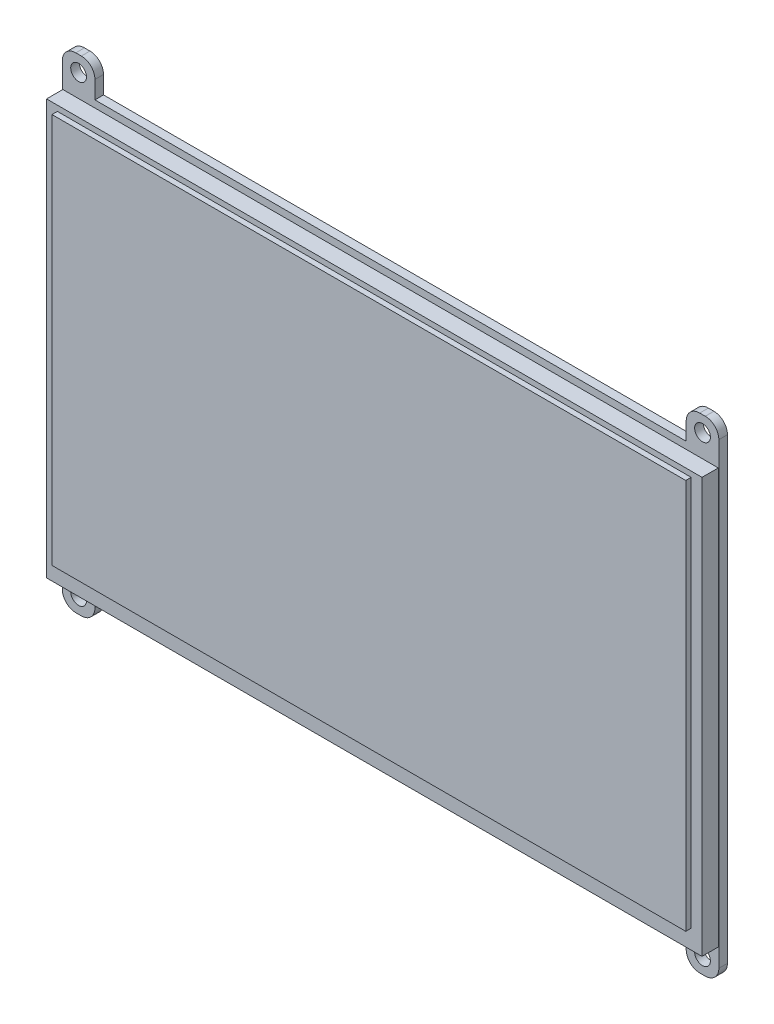
ISO-10303-21;
HEADER;
FILE_DESCRIPTION(('STEP AP214'),'2;1');
FILE_NAME('part.step','',(''),(''),'','','');
FILE_SCHEMA(('AUTOMOTIVE_DESIGN { 1 0 10303 214 1 1 1 1 }'));
ENDSEC;
DATA;
#1=APPLICATION_CONTEXT('core data for automotive mechanical design processes');
#2=APPLICATION_PROTOCOL_DEFINITION('international standard','automotive_design',2000,#1);
#3=PRODUCT_CONTEXT('',#1,'mechanical');
#4=PRODUCT('Part','Part','',(#3));
#5=PRODUCT_RELATED_PRODUCT_CATEGORY('part','',(#4));
#6=PRODUCT_DEFINITION_FORMATION('','',#4);
#7=PRODUCT_DEFINITION_CONTEXT('part definition',#1,'design');
#8=PRODUCT_DEFINITION('design','',#6,#7);
#9=PRODUCT_DEFINITION_SHAPE('','',#8);
#10=(LENGTH_UNIT() NAMED_UNIT(*) SI_UNIT(.MILLI.,.METRE.));
#11=(NAMED_UNIT(*) PLANE_ANGLE_UNIT() SI_UNIT($,.RADIAN.));
#12=(NAMED_UNIT(*) SI_UNIT($,.STERADIAN.) SOLID_ANGLE_UNIT());
#13=UNCERTAINTY_MEASURE_WITH_UNIT(LENGTH_MEASURE(1.E-05),#10,'distance_accuracy_value','');
#14=(GEOMETRIC_REPRESENTATION_CONTEXT(3) GLOBAL_UNCERTAINTY_ASSIGNED_CONTEXT((#13)) GLOBAL_UNIT_ASSIGNED_CONTEXT((#10,
#11,#12)) REPRESENTATION_CONTEXT('',''));
#15=CARTESIAN_POINT('',(0.,0.,0.));
#16=DIRECTION('',(0.,0.,1.));
#17=DIRECTION('',(1.,0.,0.));
#18=AXIS2_PLACEMENT_3D('',#15,#16,#17);
#19=CARTESIAN_POINT('',(0.,0.,4.5875));
#20=DIRECTION('',(0.,0.,1.));
#21=DIRECTION('',(1.,0.,0.));
#22=AXIS2_PLACEMENT_3D('',#19,#20,#21);
#23=PLANE('',#22);
#24=DIRECTION('',(0.,-1.,0.));
#25=VECTOR('',#24,1.);
#26=CARTESIAN_POINT('',(-60.455,37.6641957875411,4.5875));
#27=LINE('',#26,#25);
#28=CARTESIAN_POINT('',(-60.455,37.6641957875411,4.5875));
#29=VERTEX_POINT('',#28);
#30=CARTESIAN_POINT('',(-60.455,-38.865,4.5875));
#31=VERTEX_POINT('',#30);
#32=EDGE_CURVE('E254',#29,#31,#27,.T.);
#33=ORIENTED_EDGE('',*,*,#32,.T.);
#34=DIRECTION('',(1.,0.,0.));
#35=VECTOR('',#34,1.);
#36=CARTESIAN_POINT('',(-60.455,-38.865,4.5875));
#37=LINE('',#36,#35);
#38=CARTESIAN_POINT('',(60.455,-38.865,4.5875));
#39=VERTEX_POINT('',#38);
#40=EDGE_CURVE('E257',#31,#39,#37,.T.);
#41=ORIENTED_EDGE('',*,*,#40,.T.);
#42=DIRECTION('',(0.,1.,0.));
#43=VECTOR('',#42,1.);
#44=CARTESIAN_POINT('',(60.4549999999999,37.6641957875411,4.5875));
#45=LINE('',#44,#43);
#46=CARTESIAN_POINT('',(60.4549999999999,37.6641957875411,4.5875));
#47=VERTEX_POINT('',#46);
#48=EDGE_CURVE('E260',#39,#47,#45,.T.);
#49=ORIENTED_EDGE('',*,*,#48,.T.);
#50=DIRECTION('',(-1.,0.,0.));
#51=VECTOR('',#50,1.);
#52=CARTESIAN_POINT('',(-60.455,37.6641957875411,4.5875));
#53=LINE('',#52,#51);
#54=EDGE_CURVE('E262',#47,#29,#53,.T.);
#55=ORIENTED_EDGE('',*,*,#54,.T.);
#56=EDGE_LOOP('',(#33,#41,#49,#55));
#57=FACE_BOUND('',#56,.T.);
#58=DIRECTION('',(1.,0.,0.));
#59=VECTOR('',#58,1.);
#60=CARTESIAN_POINT('',(-58.455,-35.365,4.5875));
#61=LINE('',#60,#59);
#62=CARTESIAN_POINT('',(-58.455,-35.365,4.5875));
#63=VERTEX_POINT('',#62);
#64=CARTESIAN_POINT('',(58.455,-35.365,4.5875));
#65=VERTEX_POINT('',#64);
#66=EDGE_CURVE('E732',#63,#65,#61,.T.);
#67=ORIENTED_EDGE('',*,*,#66,.F.);
#68=DIRECTION('',(0.,-1.,0.));
#69=VECTOR('',#68,1.);
#70=CARTESIAN_POINT('',(-58.455,36.6641957875411,4.5875));
#71=LINE('',#70,#69);
#72=CARTESIAN_POINT('',(-58.455,36.6641957875411,4.5875));
#73=VERTEX_POINT('',#72);
#74=EDGE_CURVE('E244',#73,#63,#71,.T.);
#75=ORIENTED_EDGE('',*,*,#74,.F.);
#76=DIRECTION('',(-1.,0.,0.));
#77=VECTOR('',#76,1.);
#78=CARTESIAN_POINT('',(-58.455,36.6641957875411,4.5875));
#79=LINE('',#78,#77);
#80=CARTESIAN_POINT('',(58.455,36.6641957875411,4.5875));
#81=VERTEX_POINT('',#80);
#82=EDGE_CURVE('E240',#81,#73,#79,.T.);
#83=ORIENTED_EDGE('',*,*,#82,.F.);
#84=DIRECTION('',(0.,1.,0.));
#85=VECTOR('',#84,1.);
#86=CARTESIAN_POINT('',(58.455,36.6641957875411,4.5875));
#87=LINE('',#86,#85);
#88=EDGE_CURVE('E729',#65,#81,#87,.T.);
#89=ORIENTED_EDGE('',*,*,#88,.F.);
#90=EDGE_LOOP('',(#67,#75,#83,#89));
#91=FACE_BOUND('',#90,.T.);
#92=ADVANCED_FACE('F36',(#57,#91),#23,.T.);
#93=CARTESIAN_POINT('',(0.,0.,1.5875));
#94=DIRECTION('',(0.,0.,1.));
#95=DIRECTION('',(1.,0.,0.));
#96=AXIS2_PLACEMENT_3D('',#93,#94,#95);
#97=PLANE('',#96);
#98=DIRECTION('',(0.,-1.,0.));
#99=VECTOR('',#98,1.);
#100=CARTESIAN_POINT('',(60.555,0.,1.5875));
#101=LINE('',#100,#99);
#102=CARTESIAN_POINT('',(60.5549999999999,42.225,1.5875));
#103=VERTEX_POINT('',#102);
#104=CARTESIAN_POINT('',(60.5549999999999,-42.225,1.5875));
#105=VERTEX_POINT('',#104);
#106=EDGE_CURVE('E278',#103,#105,#101,.T.);
#107=ORIENTED_EDGE('',*,*,#106,.F.);
#108=CARTESIAN_POINT('',(58.0549999999999,42.225,1.5875));
#109=DIRECTION('',(0.,0.,1.));
#110=DIRECTION('',(1.,0.,0.));
#111=AXIS2_PLACEMENT_3D('',#108,#109,#110);
#112=CIRCLE('',#111,2.5);
#113=CARTESIAN_POINT('',(58.0549999999999,44.725,1.5875));
#114=VERTEX_POINT('',#113);
#115=EDGE_CURVE('E281',#114,#103,#112,.F.);
#116=ORIENTED_EDGE('',*,*,#115,.F.);
#117=DIRECTION('',(-1.,0.,0.));
#118=VECTOR('',#117,1.);
#119=CARTESIAN_POINT('',(0.,44.725,1.5875));
#120=LINE('',#119,#118);
#121=CARTESIAN_POINT('',(57.0349999999999,44.725,1.5875));
#122=VERTEX_POINT('',#121);
#123=EDGE_CURVE('E285',#114,#122,#120,.T.);
#124=ORIENTED_EDGE('',*,*,#123,.T.);
#125=CARTESIAN_POINT('',(57.0349999999999,42.225,1.5875));
#126=DIRECTION('',(0.,0.,1.));
#127=DIRECTION('',(1.,0.,0.));
#128=AXIS2_PLACEMENT_3D('',#125,#126,#127);
#129=CIRCLE('',#128,2.5);
#130=CARTESIAN_POINT('',(54.5349999999999,42.225,1.5875));
#131=VERTEX_POINT('',#130);
#132=EDGE_CURVE('E287',#122,#131,#129,.T.);
#133=ORIENTED_EDGE('',*,*,#132,.T.);
#134=DIRECTION('',(0.,1.,0.));
#135=VECTOR('',#134,1.);
#136=CARTESIAN_POINT('',(54.5349999999999,0.,1.5875));
#137=LINE('',#136,#135);
#138=CARTESIAN_POINT('',(54.5349999999999,38.965,1.5875));
#139=VERTEX_POINT('',#138);
#140=EDGE_CURVE('E289',#139,#131,#137,.T.);
#141=ORIENTED_EDGE('',*,*,#140,.F.);
#142=DIRECTION('',(1.,0.,0.));
#143=VECTOR('',#142,1.);
#144=CARTESIAN_POINT('',(0.,38.965,1.5875));
#145=LINE('',#144,#143);
#146=CARTESIAN_POINT('',(-54.535,38.965,1.5875));
#147=VERTEX_POINT('',#146);
#148=EDGE_CURVE('E292',#147,#139,#145,.T.);
#149=ORIENTED_EDGE('',*,*,#148,.F.);
#150=DIRECTION('',(0.,1.,0.));
#151=VECTOR('',#150,1.);
#152=CARTESIAN_POINT('',(-54.535,0.,1.5875));
#153=LINE('',#152,#151);
#154=CARTESIAN_POINT('',(-54.535,42.225,1.5875));
#155=VERTEX_POINT('',#154);
#156=EDGE_CURVE('E295',#147,#155,#153,.T.);
#157=ORIENTED_EDGE('',*,*,#156,.T.);
#158=CARTESIAN_POINT('',(-57.035,42.225,1.5875));
#159=DIRECTION('',(0.,0.,1.));
#160=DIRECTION('',(1.,0.,0.));
#161=AXIS2_PLACEMENT_3D('',#158,#159,#160);
#162=CIRCLE('',#161,2.5);
#163=CARTESIAN_POINT('',(-57.035,44.725,1.5875));
#164=VERTEX_POINT('',#163);
#165=EDGE_CURVE('E297',#164,#155,#162,.F.);
#166=ORIENTED_EDGE('',*,*,#165,.F.);
#167=DIRECTION('',(1.,0.,0.));
#168=VECTOR('',#167,1.);
#169=CARTESIAN_POINT('',(0.,44.725,1.5875));
#170=LINE('',#169,#168);
#171=CARTESIAN_POINT('',(-58.055,44.725,1.5875));
#172=VERTEX_POINT('',#171);
#173=EDGE_CURVE('E300',#172,#164,#170,.T.);
#174=ORIENTED_EDGE('',*,*,#173,.F.);
#175=CARTESIAN_POINT('',(-58.055,42.225,1.5875));
#176=DIRECTION('',(0.,0.,1.));
#177=DIRECTION('',(1.,0.,0.));
#178=AXIS2_PLACEMENT_3D('',#175,#176,#177);
#179=CIRCLE('',#178,2.5);
#180=CARTESIAN_POINT('',(-60.555,42.225,1.5875));
#181=VERTEX_POINT('',#180);
#182=EDGE_CURVE('E303',#172,#181,#179,.T.);
#183=ORIENTED_EDGE('',*,*,#182,.T.);
#184=DIRECTION('',(0.,-1.,0.));
#185=VECTOR('',#184,1.);
#186=CARTESIAN_POINT('',(-60.555,0.,1.5875));
#187=LINE('',#186,#185);
#188=CARTESIAN_POINT('',(-60.555,-42.225,1.5875));
#189=VERTEX_POINT('',#188);
#190=EDGE_CURVE('E305',#181,#189,#187,.T.);
#191=ORIENTED_EDGE('',*,*,#190,.T.);
#192=CARTESIAN_POINT('',(-58.055,-42.225,1.5875));
#193=DIRECTION('',(0.,0.,1.));
#194=DIRECTION('',(1.,0.,0.));
#195=AXIS2_PLACEMENT_3D('',#192,#193,#194);
#196=CIRCLE('',#195,2.5);
#197=CARTESIAN_POINT('',(-58.055,-44.725,1.5875));
#198=VERTEX_POINT('',#197);
#199=EDGE_CURVE('E307',#198,#189,#196,.F.);
#200=ORIENTED_EDGE('',*,*,#199,.F.);
#201=DIRECTION('',(1.,0.,0.));
#202=VECTOR('',#201,1.);
#203=CARTESIAN_POINT('',(0.,-44.725,1.5875));
#204=LINE('',#203,#202);
#205=CARTESIAN_POINT('',(-57.035,-44.725,1.5875));
#206=VERTEX_POINT('',#205);
#207=EDGE_CURVE('E310',#198,#206,#204,.T.);
#208=ORIENTED_EDGE('',*,*,#207,.T.);
#209=CARTESIAN_POINT('',(-57.035,-42.225,1.5875));
#210=DIRECTION('',(0.,0.,1.));
#211=DIRECTION('',(1.,0.,0.));
#212=AXIS2_PLACEMENT_3D('',#209,#210,#211);
#213=CIRCLE('',#212,2.5);
#214=CARTESIAN_POINT('',(-54.535,-42.225,1.5875));
#215=VERTEX_POINT('',#214);
#216=EDGE_CURVE('E312',#206,#215,#213,.T.);
#217=ORIENTED_EDGE('',*,*,#216,.T.);
#218=DIRECTION('',(0.,-1.,0.));
#219=VECTOR('',#218,1.);
#220=CARTESIAN_POINT('',(-54.535,0.,1.5875));
#221=LINE('',#220,#219);
#222=CARTESIAN_POINT('',(-54.535,-38.965,1.5875));
#223=VERTEX_POINT('',#222);
#224=EDGE_CURVE('E314',#223,#215,#221,.T.);
#225=ORIENTED_EDGE('',*,*,#224,.F.);
#226=DIRECTION('',(1.,0.,0.));
#227=VECTOR('',#226,1.);
#228=CARTESIAN_POINT('',(0.,-38.965,1.5875));
#229=LINE('',#228,#227);
#230=CARTESIAN_POINT('',(54.5349999999999,-38.965,1.5875));
#231=VERTEX_POINT('',#230);
#232=EDGE_CURVE('E317',#223,#231,#229,.T.);
#233=ORIENTED_EDGE('',*,*,#232,.T.);
#234=DIRECTION('',(0.,-1.,0.));
#235=VECTOR('',#234,1.);
#236=CARTESIAN_POINT('',(54.5349999999999,0.,1.5875));
#237=LINE('',#236,#235);
#238=CARTESIAN_POINT('',(54.5349999999999,-42.225,1.5875));
#239=VERTEX_POINT('',#238);
#240=EDGE_CURVE('E319',#231,#239,#237,.T.);
#241=ORIENTED_EDGE('',*,*,#240,.T.);
#242=CARTESIAN_POINT('',(57.0349999999999,-42.225,1.5875));
#243=DIRECTION('',(0.,0.,1.));
#244=DIRECTION('',(1.,0.,0.));
#245=AXIS2_PLACEMENT_3D('',#242,#243,#244);
#246=CIRCLE('',#245,2.5);
#247=CARTESIAN_POINT('',(57.0349999999999,-44.725,1.5875));
#248=VERTEX_POINT('',#247);
#249=EDGE_CURVE('E321',#248,#239,#246,.F.);
#250=ORIENTED_EDGE('',*,*,#249,.F.);
#251=DIRECTION('',(-1.,0.,0.));
#252=VECTOR('',#251,1.);
#253=CARTESIAN_POINT('',(0.,-44.725,1.5875));
#254=LINE('',#253,#252);
#255=CARTESIAN_POINT('',(58.0549999999999,-44.725,1.5875));
#256=VERTEX_POINT('',#255);
#257=EDGE_CURVE('E324',#256,#248,#254,.T.);
#258=ORIENTED_EDGE('',*,*,#257,.F.);
#259=CARTESIAN_POINT('',(58.0549999999999,-42.225,1.5875));
#260=DIRECTION('',(0.,0.,1.));
#261=DIRECTION('',(1.,0.,0.));
#262=AXIS2_PLACEMENT_3D('',#259,#260,#261);
#263=CIRCLE('',#262,2.5);
#264=EDGE_CURVE('E327',#256,#105,#263,.T.);
#265=ORIENTED_EDGE('',*,*,#264,.T.);
#266=EDGE_LOOP('',(#107,#116,#124,#133,#141,#149,#157,#166,#174,#183,#191,#200,#208,#217,#225,
#233,#241,#250,#258,#265));
#267=FACE_BOUND('',#266,.T.);
#268=CARTESIAN_POINT('',(57.5449999999999,-41.845,1.5875));
#269=DIRECTION('',(0.,0.,1.));
#270=DIRECTION('',(1.,0.,0.));
#271=AXIS2_PLACEMENT_3D('',#268,#269,#270);
#272=CIRCLE('',#271,1.45439987565386);
#273=CARTESIAN_POINT('',(58.9993998756538,-41.845,1.5875));
#274=VERTEX_POINT('',#273);
#275=EDGE_CURVE('E329',#274,#274,#272,.T.);
#276=ORIENTED_EDGE('',*,*,#275,.F.);
#277=EDGE_LOOP('',(#276));
#278=FACE_BOUND('',#277,.T.);
#279=CARTESIAN_POINT('',(-57.545,-41.845,1.5875));
#280=DIRECTION('',(0.,0.,1.));
#281=DIRECTION('',(1.,0.,0.));
#282=AXIS2_PLACEMENT_3D('',#279,#280,#281);
#283=CIRCLE('',#282,1.45439987565386);
#284=CARTESIAN_POINT('',(-56.0906001243462,-41.845,1.5875));
#285=VERTEX_POINT('',#284);
#286=EDGE_CURVE('E332',#285,#285,#283,.F.);
#287=ORIENTED_EDGE('',*,*,#286,.T.);
#288=EDGE_LOOP('',(#287));
#289=FACE_BOUND('',#288,.T.);
#290=CARTESIAN_POINT('',(57.5449999999999,41.845,1.5875));
#291=DIRECTION('',(0.,0.,1.));
#292=DIRECTION('',(1.,0.,0.));
#293=AXIS2_PLACEMENT_3D('',#290,#291,#292);
#294=CIRCLE('',#293,1.45439987565386);
#295=CARTESIAN_POINT('',(58.9993998756538,41.845,1.5875));
#296=VERTEX_POINT('',#295);
#297=EDGE_CURVE('E335',#296,#296,#294,.F.);
#298=ORIENTED_EDGE('',*,*,#297,.T.);
#299=EDGE_LOOP('',(#298));
#300=FACE_BOUND('',#299,.T.);
#301=CARTESIAN_POINT('',(-57.545,41.845,1.5875));
#302=DIRECTION('',(0.,0.,1.));
#303=DIRECTION('',(1.,0.,0.));
#304=AXIS2_PLACEMENT_3D('',#301,#302,#303);
#305=CIRCLE('',#304,1.45439987565386);
#306=CARTESIAN_POINT('',(-56.0906001243462,41.845,1.5875));
#307=VERTEX_POINT('',#306);
#308=EDGE_CURVE('E338',#307,#307,#305,.T.);
#309=ORIENTED_EDGE('',*,*,#308,.F.);
#310=EDGE_LOOP('',(#309));
#311=FACE_BOUND('',#310,.T.);
#312=DIRECTION('',(1.,0.,0.));
#313=VECTOR('',#312,1.);
#314=CARTESIAN_POINT('',(-60.455,-38.865,1.5875));
#315=LINE('',#314,#313);
#316=CARTESIAN_POINT('',(-60.455,-38.865,1.5875));
#317=VERTEX_POINT('',#316);
#318=CARTESIAN_POINT('',(60.455,-38.865,1.5875));
#319=VERTEX_POINT('',#318);
#320=EDGE_CURVE('E249',#317,#319,#315,.T.);
#321=ORIENTED_EDGE('',*,*,#320,.F.);
#322=DIRECTION('',(0.,-1.,0.));
#323=VECTOR('',#322,1.);
#324=CARTESIAN_POINT('',(-60.455,37.6641957875411,1.5875));
#325=LINE('',#324,#323);
#326=CARTESIAN_POINT('',(-60.455,37.6641957875411,1.5875));
#327=VERTEX_POINT('',#326);
#328=EDGE_CURVE('E246',#327,#317,#325,.T.);
#329=ORIENTED_EDGE('',*,*,#328,.F.);
#330=DIRECTION('',(-1.,0.,0.));
#331=VECTOR('',#330,1.);
#332=CARTESIAN_POINT('',(-60.455,37.6641957875411,1.5875));
#333=LINE('',#332,#331);
#334=CARTESIAN_POINT('',(60.4549999999999,37.6641957875411,1.5875));
#335=VERTEX_POINT('',#334);
#336=EDGE_CURVE('E258',#335,#327,#333,.T.);
#337=ORIENTED_EDGE('',*,*,#336,.F.);
#338=DIRECTION('',(0.,1.,0.));
#339=VECTOR('',#338,1.);
#340=CARTESIAN_POINT('',(60.4549999999999,37.6641957875411,1.5875));
#341=LINE('',#340,#339);
#342=EDGE_CURVE('E266',#319,#335,#341,.T.);
#343=ORIENTED_EDGE('',*,*,#342,.F.);
#344=EDGE_LOOP('',(#321,#329,#337,#343));
#345=FACE_BOUND('',#344,.T.);
#346=ADVANCED_FACE('F538',(#267,#278,#289,#300,#311,#345),#97,.T.);
#347=CARTESIAN_POINT('',(60.555,0.,1.5875));
#348=DIRECTION('',(1.,0.,0.));
#349=DIRECTION('',(0.,1.,0.));
#350=AXIS2_PLACEMENT_3D('',#347,#348,#349);
#351=PLANE('',#350);
#352=DIRECTION('',(0.,-1.,0.));
#353=VECTOR('',#352,1.);
#354=CARTESIAN_POINT('',(60.555,0.,0.));
#355=LINE('',#354,#353);
#356=CARTESIAN_POINT('',(60.5549999999999,42.225,0.));
#357=VERTEX_POINT('',#356);
#358=CARTESIAN_POINT('',(60.5549999999999,-42.225,0.));
#359=VERTEX_POINT('',#358);
#360=EDGE_CURVE('E277',#357,#359,#355,.T.);
#361=ORIENTED_EDGE('',*,*,#360,.F.);
#362=DIRECTION('',(0.,0.,-1.));
#363=VECTOR('',#362,1.);
#364=CARTESIAN_POINT('',(60.5549999999999,42.225,1.5875));
#365=LINE('',#364,#363);
#366=EDGE_CURVE('E11',#103,#357,#365,.T.);
#367=ORIENTED_EDGE('',*,*,#366,.F.);
#368=ORIENTED_EDGE('',*,*,#106,.T.);
#369=DIRECTION('',(0.,0.,-1.));
#370=VECTOR('',#369,1.);
#371=CARTESIAN_POINT('',(60.5549999999999,-42.225,1.5875));
#372=LINE('',#371,#370);
#373=EDGE_CURVE('E341',#105,#359,#372,.T.);
#374=ORIENTED_EDGE('',*,*,#373,.T.);
#375=EDGE_LOOP('',(#361,#367,#368,#374));
#376=FACE_BOUND('',#375,.T.);
#377=ADVANCED_FACE('F38',(#376),#351,.T.);
#378=CARTESIAN_POINT('',(58.0549999999999,42.225,1.5875));
#379=DIRECTION('',(0.,0.,-1.));
#380=DIRECTION('',(-1.,0.,0.));
#381=AXIS2_PLACEMENT_3D('',#378,#379,#380);
#382=CYLINDRICAL_SURFACE('',#381,2.5);
#383=CARTESIAN_POINT('',(58.0549999999999,42.225,0.));
#384=DIRECTION('',(0.,0.,1.));
#385=DIRECTION('',(1.,0.,0.));
#386=AXIS2_PLACEMENT_3D('',#383,#384,#385);
#387=CIRCLE('',#386,2.5);
#388=CARTESIAN_POINT('',(58.0549999999999,44.725,0.));
#389=VERTEX_POINT('',#388);
#390=EDGE_CURVE('E344',#389,#357,#387,.F.);
#391=ORIENTED_EDGE('',*,*,#390,.F.);
#392=DIRECTION('',(0.,0.,-1.));
#393=VECTOR('',#392,1.);
#394=CARTESIAN_POINT('',(58.0549999999999,44.725,1.5875));
#395=LINE('',#394,#393);
#396=EDGE_CURVE('E44',#114,#389,#395,.T.);
#397=ORIENTED_EDGE('',*,*,#396,.F.);
#398=ORIENTED_EDGE('',*,*,#115,.T.);
#399=ORIENTED_EDGE('',*,*,#366,.T.);
#400=EDGE_LOOP('',(#391,#397,#398,#399));
#401=FACE_BOUND('',#400,.T.);
#402=ADVANCED_FACE('F458',(#401),#382,.T.);
#403=CARTESIAN_POINT('',(0.,44.725,1.5875));
#404=DIRECTION('',(0.,-1.,0.));
#405=DIRECTION('',(0.,0.,-1.));
#406=AXIS2_PLACEMENT_3D('',#403,#404,#405);
#407=PLANE('',#406);
#408=DIRECTION('',(-1.,0.,0.));
#409=VECTOR('',#408,1.);
#410=CARTESIAN_POINT('',(0.,44.725,0.));
#411=LINE('',#410,#409);
#412=CARTESIAN_POINT('',(57.0349999999999,44.725,0.));
#413=VERTEX_POINT('',#412);
#414=EDGE_CURVE('E347',#389,#413,#411,.T.);
#415=ORIENTED_EDGE('',*,*,#414,.T.);
#416=DIRECTION('',(0.,0.,-1.));
#417=VECTOR('',#416,1.);
#418=CARTESIAN_POINT('',(57.0349999999999,44.725,1.5875));
#419=LINE('',#418,#417);
#420=EDGE_CURVE('E444',#122,#413,#419,.T.);
#421=ORIENTED_EDGE('',*,*,#420,.F.);
#422=ORIENTED_EDGE('',*,*,#123,.F.);
#423=ORIENTED_EDGE('',*,*,#396,.T.);
#424=EDGE_LOOP('',(#415,#421,#422,#423));
#425=FACE_BOUND('',#424,.T.);
#426=ADVANCED_FACE('F449',(#425),#407,.F.);
#427=CARTESIAN_POINT('',(57.0349999999999,42.225,1.5875));
#428=DIRECTION('',(0.,0.,-1.));
#429=DIRECTION('',(-1.,0.,0.));
#430=AXIS2_PLACEMENT_3D('',#427,#428,#429);
#431=CYLINDRICAL_SURFACE('',#430,2.5);
#432=CARTESIAN_POINT('',(57.0349999999999,42.225,0.));
#433=DIRECTION('',(0.,0.,1.));
#434=DIRECTION('',(1.,0.,0.));
#435=AXIS2_PLACEMENT_3D('',#432,#433,#434);
#436=CIRCLE('',#435,2.5);
#437=CARTESIAN_POINT('',(54.5349999999999,42.225,0.));
#438=VERTEX_POINT('',#437);
#439=EDGE_CURVE('E349',#413,#438,#436,.T.);
#440=ORIENTED_EDGE('',*,*,#439,.T.);
#441=DIRECTION('',(0.,0.,-1.));
#442=VECTOR('',#441,1.);
#443=CARTESIAN_POINT('',(54.5349999999999,42.225,1.5875));
#444=LINE('',#443,#442);
#445=EDGE_CURVE('E442',#131,#438,#444,.T.);
#446=ORIENTED_EDGE('',*,*,#445,.F.);
#447=ORIENTED_EDGE('',*,*,#132,.F.);
#448=ORIENTED_EDGE('',*,*,#420,.T.);
#449=EDGE_LOOP('',(#440,#446,#447,#448));
#450=FACE_BOUND('',#449,.T.);
#451=ADVANCED_FACE('F536',(#450),#431,.T.);
#452=CARTESIAN_POINT('',(54.5349999999999,0.,1.5875));
#453=DIRECTION('',(-1.,0.,0.));
#454=DIRECTION('',(0.,0.,1.));
#455=AXIS2_PLACEMENT_3D('',#452,#453,#454);
#456=PLANE('',#455);
#457=DIRECTION('',(0.,1.,0.));
#458=VECTOR('',#457,1.);
#459=CARTESIAN_POINT('',(54.5349999999999,0.,0.));
#460=LINE('',#459,#458);
#461=CARTESIAN_POINT('',(54.5349999999999,38.965,0.));
#462=VERTEX_POINT('',#461);
#463=EDGE_CURVE('E352',#462,#438,#460,.T.);
#464=ORIENTED_EDGE('',*,*,#463,.F.);
#465=DIRECTION('',(0.,0.,-1.));
#466=VECTOR('',#465,1.);
#467=CARTESIAN_POINT('',(54.5349999999999,38.965,1.5875));
#468=LINE('',#467,#466);
#469=EDGE_CURVE('E440',#139,#462,#468,.T.);
#470=ORIENTED_EDGE('',*,*,#469,.F.);
#471=ORIENTED_EDGE('',*,*,#140,.T.);
#472=ORIENTED_EDGE('',*,*,#445,.T.);
#473=EDGE_LOOP('',(#464,#470,#471,#472));
#474=FACE_BOUND('',#473,.T.);
#475=ADVANCED_FACE('F531',(#474),#456,.T.);
#476=CARTESIAN_POINT('',(0.,38.965,1.5875));
#477=DIRECTION('',(0.,1.,0.));
#478=DIRECTION('',(0.,0.,1.));
#479=AXIS2_PLACEMENT_3D('',#476,#477,#478);
#480=PLANE('',#479);
#481=DIRECTION('',(1.,0.,0.));
#482=VECTOR('',#481,1.);
#483=CARTESIAN_POINT('',(0.,38.965,0.));
#484=LINE('',#483,#482);
#485=CARTESIAN_POINT('',(-54.535,38.965,0.));
#486=VERTEX_POINT('',#485);
#487=EDGE_CURVE('E355',#486,#462,#484,.T.);
#488=ORIENTED_EDGE('',*,*,#487,.F.);
#489=DIRECTION('',(0.,0.,-1.));
#490=VECTOR('',#489,1.);
#491=CARTESIAN_POINT('',(-54.535,38.965,1.5875));
#492=LINE('',#491,#490);
#493=EDGE_CURVE('E438',#147,#486,#492,.T.);
#494=ORIENTED_EDGE('',*,*,#493,.F.);
#495=ORIENTED_EDGE('',*,*,#148,.T.);
#496=ORIENTED_EDGE('',*,*,#469,.T.);
#497=EDGE_LOOP('',(#488,#494,#495,#496));
#498=FACE_BOUND('',#497,.T.);
#499=ADVANCED_FACE('F528',(#498),#480,.T.);
#500=CARTESIAN_POINT('',(-54.535,0.,1.5875));
#501=DIRECTION('',(-1.,0.,0.));
#502=DIRECTION('',(0.,0.,1.));
#503=AXIS2_PLACEMENT_3D('',#500,#501,#502);
#504=PLANE('',#503);
#505=DIRECTION('',(0.,1.,0.));
#506=VECTOR('',#505,1.);
#507=CARTESIAN_POINT('',(-54.535,0.,0.));
#508=LINE('',#507,#506);
#509=CARTESIAN_POINT('',(-54.535,42.225,0.));
#510=VERTEX_POINT('',#509);
#511=EDGE_CURVE('E358',#486,#510,#508,.T.);
#512=ORIENTED_EDGE('',*,*,#511,.T.);
#513=DIRECTION('',(0.,0.,-1.));
#514=VECTOR('',#513,1.);
#515=CARTESIAN_POINT('',(-54.535,42.225,1.5875));
#516=LINE('',#515,#514);
#517=EDGE_CURVE('E436',#155,#510,#516,.T.);
#518=ORIENTED_EDGE('',*,*,#517,.F.);
#519=ORIENTED_EDGE('',*,*,#156,.F.);
#520=ORIENTED_EDGE('',*,*,#493,.T.);
#521=EDGE_LOOP('',(#512,#518,#519,#520));
#522=FACE_BOUND('',#521,.T.);
#523=ADVANCED_FACE('F525',(#522),#504,.F.);
#524=CARTESIAN_POINT('',(-57.035,42.225,1.5875));
#525=DIRECTION('',(0.,0.,-1.));
#526=DIRECTION('',(-1.,0.,0.));
#527=AXIS2_PLACEMENT_3D('',#524,#525,#526);
#528=CYLINDRICAL_SURFACE('',#527,2.5);
#529=CARTESIAN_POINT('',(-57.035,42.225,0.));
#530=DIRECTION('',(0.,0.,1.));
#531=DIRECTION('',(1.,0.,0.));
#532=AXIS2_PLACEMENT_3D('',#529,#530,#531);
#533=CIRCLE('',#532,2.5);
#534=CARTESIAN_POINT('',(-57.035,44.725,0.));
#535=VERTEX_POINT('',#534);
#536=EDGE_CURVE('E361',#535,#510,#533,.F.);
#537=ORIENTED_EDGE('',*,*,#536,.F.);
#538=DIRECTION('',(0.,0.,-1.));
#539=VECTOR('',#538,1.);
#540=CARTESIAN_POINT('',(-57.035,44.725,1.5875));
#541=LINE('',#540,#539);
#542=EDGE_CURVE('E434',#164,#535,#541,.T.);
#543=ORIENTED_EDGE('',*,*,#542,.F.);
#544=ORIENTED_EDGE('',*,*,#165,.T.);
#545=ORIENTED_EDGE('',*,*,#517,.T.);
#546=EDGE_LOOP('',(#537,#543,#544,#545));
#547=FACE_BOUND('',#546,.T.);
#548=ADVANCED_FACE('F520',(#547),#528,.T.);
#549=CARTESIAN_POINT('',(0.,44.725,1.5875));
#550=DIRECTION('',(0.,1.,0.));
#551=DIRECTION('',(0.,0.,1.));
#552=AXIS2_PLACEMENT_3D('',#549,#550,#551);
#553=PLANE('',#552);
#554=DIRECTION('',(1.,0.,0.));
#555=VECTOR('',#554,1.);
#556=CARTESIAN_POINT('',(0.,44.725,0.));
#557=LINE('',#556,#555);
#558=CARTESIAN_POINT('',(-58.055,44.725,0.));
#559=VERTEX_POINT('',#558);
#560=EDGE_CURVE('E364',#559,#535,#557,.T.);
#561=ORIENTED_EDGE('',*,*,#560,.F.);
#562=DIRECTION('',(0.,0.,-1.));
#563=VECTOR('',#562,1.);
#564=CARTESIAN_POINT('',(-58.055,44.725,1.5875));
#565=LINE('',#564,#563);
#566=EDGE_CURVE('E432',#172,#559,#565,.T.);
#567=ORIENTED_EDGE('',*,*,#566,.F.);
#568=ORIENTED_EDGE('',*,*,#173,.T.);
#569=ORIENTED_EDGE('',*,*,#542,.T.);
#570=EDGE_LOOP('',(#561,#567,#568,#569));
#571=FACE_BOUND('',#570,.T.);
#572=ADVANCED_FACE('F515',(#571),#553,.T.);
#573=CARTESIAN_POINT('',(-58.055,42.225,1.5875));
#574=DIRECTION('',(0.,0.,-1.));
#575=DIRECTION('',(-1.,0.,0.));
#576=AXIS2_PLACEMENT_3D('',#573,#574,#575);
#577=CYLINDRICAL_SURFACE('',#576,2.5);
#578=CARTESIAN_POINT('',(-58.055,42.225,0.));
#579=DIRECTION('',(0.,0.,1.));
#580=DIRECTION('',(1.,0.,0.));
#581=AXIS2_PLACEMENT_3D('',#578,#579,#580);
#582=CIRCLE('',#581,2.5);
#583=CARTESIAN_POINT('',(-60.555,42.225,0.));
#584=VERTEX_POINT('',#583);
#585=EDGE_CURVE('E367',#559,#584,#582,.T.);
#586=ORIENTED_EDGE('',*,*,#585,.T.);
#587=DIRECTION('',(0.,0.,-1.));
#588=VECTOR('',#587,1.);
#589=CARTESIAN_POINT('',(-60.555,42.225,1.5875));
#590=LINE('',#589,#588);
#591=EDGE_CURVE('E429',#181,#584,#590,.T.);
#592=ORIENTED_EDGE('',*,*,#591,.F.);
#593=ORIENTED_EDGE('',*,*,#182,.F.);
#594=ORIENTED_EDGE('',*,*,#566,.T.);
#595=EDGE_LOOP('',(#586,#592,#593,#594));
#596=FACE_BOUND('',#595,.T.);
#597=ADVANCED_FACE('F512',(#596),#577,.T.);
#598=CARTESIAN_POINT('',(-60.555,0.,1.5875));
#599=DIRECTION('',(1.,0.,0.));
#600=DIRECTION('',(0.,1.,0.));
#601=AXIS2_PLACEMENT_3D('',#598,#599,#600);
#602=PLANE('',#601);
#603=DIRECTION('',(0.,-1.,0.));
#604=VECTOR('',#603,1.);
#605=CARTESIAN_POINT('',(-60.555,0.,0.));
#606=LINE('',#605,#604);
#607=CARTESIAN_POINT('',(-60.555,-42.225,0.));
#608=VERTEX_POINT('',#607);
#609=EDGE_CURVE('E369',#584,#608,#606,.T.);
#610=ORIENTED_EDGE('',*,*,#609,.T.);
#611=DIRECTION('',(0.,0.,-1.));
#612=VECTOR('',#611,1.);
#613=CARTESIAN_POINT('',(-60.555,-42.225,1.5875));
#614=LINE('',#613,#612);
#615=EDGE_CURVE('E427',#189,#608,#614,.T.);
#616=ORIENTED_EDGE('',*,*,#615,.F.);
#617=ORIENTED_EDGE('',*,*,#190,.F.);
#618=ORIENTED_EDGE('',*,*,#591,.T.);
#619=EDGE_LOOP('',(#610,#616,#617,#618));
#620=FACE_BOUND('',#619,.T.);
#621=ADVANCED_FACE('F507',(#620),#602,.F.);
#622=CARTESIAN_POINT('',(-58.055,-42.225,1.5875));
#623=DIRECTION('',(0.,0.,-1.));
#624=DIRECTION('',(-1.,0.,0.));
#625=AXIS2_PLACEMENT_3D('',#622,#623,#624);
#626=CYLINDRICAL_SURFACE('',#625,2.5);
#627=CARTESIAN_POINT('',(-58.055,-42.225,0.));
#628=DIRECTION('',(0.,0.,1.));
#629=DIRECTION('',(1.,0.,0.));
#630=AXIS2_PLACEMENT_3D('',#627,#628,#629);
#631=CIRCLE('',#630,2.5);
#632=CARTESIAN_POINT('',(-58.055,-44.725,0.));
#633=VERTEX_POINT('',#632);
#634=EDGE_CURVE('E372',#633,#608,#631,.F.);
#635=ORIENTED_EDGE('',*,*,#634,.F.);
#636=DIRECTION('',(0.,0.,-1.));
#637=VECTOR('',#636,1.);
#638=CARTESIAN_POINT('',(-58.055,-44.725,1.5875));
#639=LINE('',#638,#637);
#640=EDGE_CURVE('E425',#198,#633,#639,.T.);
#641=ORIENTED_EDGE('',*,*,#640,.F.);
#642=ORIENTED_EDGE('',*,*,#199,.T.);
#643=ORIENTED_EDGE('',*,*,#615,.T.);
#644=EDGE_LOOP('',(#635,#641,#642,#643));
#645=FACE_BOUND('',#644,.T.);
#646=ADVANCED_FACE('F501',(#645),#626,.T.);
#647=CARTESIAN_POINT('',(0.,-44.725,1.5875));
#648=DIRECTION('',(0.,1.,0.));
#649=DIRECTION('',(0.,0.,1.));
#650=AXIS2_PLACEMENT_3D('',#647,#648,#649);
#651=PLANE('',#650);
#652=DIRECTION('',(1.,0.,0.));
#653=VECTOR('',#652,1.);
#654=CARTESIAN_POINT('',(0.,-44.725,0.));
#655=LINE('',#654,#653);
#656=CARTESIAN_POINT('',(-57.035,-44.725,0.));
#657=VERTEX_POINT('',#656);
#658=EDGE_CURVE('E375',#633,#657,#655,.T.);
#659=ORIENTED_EDGE('',*,*,#658,.T.);
#660=DIRECTION('',(0.,0.,-1.));
#661=VECTOR('',#660,1.);
#662=CARTESIAN_POINT('',(-57.035,-44.725,1.5875));
#663=LINE('',#662,#661);
#664=EDGE_CURVE('E422',#206,#657,#663,.T.);
#665=ORIENTED_EDGE('',*,*,#664,.F.);
#666=ORIENTED_EDGE('',*,*,#207,.F.);
#667=ORIENTED_EDGE('',*,*,#640,.T.);
#668=EDGE_LOOP('',(#659,#665,#666,#667));
#669=FACE_BOUND('',#668,.T.);
#670=ADVANCED_FACE('F498',(#669),#651,.F.);
#671=CARTESIAN_POINT('',(-57.035,-42.225,1.5875));
#672=DIRECTION('',(0.,0.,-1.));
#673=DIRECTION('',(-1.,0.,0.));
#674=AXIS2_PLACEMENT_3D('',#671,#672,#673);
#675=CYLINDRICAL_SURFACE('',#674,2.5);
#676=CARTESIAN_POINT('',(-57.035,-42.225,0.));
#677=DIRECTION('',(0.,0.,1.));
#678=DIRECTION('',(1.,0.,0.));
#679=AXIS2_PLACEMENT_3D('',#676,#677,#678);
#680=CIRCLE('',#679,2.5);
#681=CARTESIAN_POINT('',(-54.535,-42.225,0.));
#682=VERTEX_POINT('',#681);
#683=EDGE_CURVE('E377',#657,#682,#680,.T.);
#684=ORIENTED_EDGE('',*,*,#683,.T.);
#685=DIRECTION('',(0.,0.,-1.));
#686=VECTOR('',#685,1.);
#687=CARTESIAN_POINT('',(-54.535,-42.225,1.5875));
#688=LINE('',#687,#686);
#689=EDGE_CURVE('E420',#215,#682,#688,.T.);
#690=ORIENTED_EDGE('',*,*,#689,.F.);
#691=ORIENTED_EDGE('',*,*,#216,.F.);
#692=ORIENTED_EDGE('',*,*,#664,.T.);
#693=EDGE_LOOP('',(#684,#690,#691,#692));
#694=FACE_BOUND('',#693,.T.);
#695=ADVANCED_FACE('F493',(#694),#675,.T.);
#696=CARTESIAN_POINT('',(-54.535,0.,1.5875));
#697=DIRECTION('',(1.,0.,0.));
#698=DIRECTION('',(0.,0.,-1.));
#699=AXIS2_PLACEMENT_3D('',#696,#697,#698);
#700=PLANE('',#699);
#701=DIRECTION('',(0.,-1.,0.));
#702=VECTOR('',#701,1.);
#703=CARTESIAN_POINT('',(-54.535,0.,0.));
#704=LINE('',#703,#702);
#705=CARTESIAN_POINT('',(-54.535,-38.965,0.));
#706=VERTEX_POINT('',#705);
#707=EDGE_CURVE('E380',#706,#682,#704,.T.);
#708=ORIENTED_EDGE('',*,*,#707,.F.);
#709=DIRECTION('',(0.,0.,-1.));
#710=VECTOR('',#709,1.);
#711=CARTESIAN_POINT('',(-54.535,-38.965,1.5875));
#712=LINE('',#711,#710);
#713=EDGE_CURVE('E418',#223,#706,#712,.T.);
#714=ORIENTED_EDGE('',*,*,#713,.F.);
#715=ORIENTED_EDGE('',*,*,#224,.T.);
#716=ORIENTED_EDGE('',*,*,#689,.T.);
#717=EDGE_LOOP('',(#708,#714,#715,#716));
#718=FACE_BOUND('',#717,.T.);
#719=ADVANCED_FACE('F487',(#718),#700,.T.);
#720=CARTESIAN_POINT('',(0.,-38.965,1.5875));
#721=DIRECTION('',(0.,1.,0.));
#722=DIRECTION('',(0.,0.,1.));
#723=AXIS2_PLACEMENT_3D('',#720,#721,#722);
#724=PLANE('',#723);
#725=DIRECTION('',(1.,0.,0.));
#726=VECTOR('',#725,1.);
#727=CARTESIAN_POINT('',(0.,-38.965,0.));
#728=LINE('',#727,#726);
#729=CARTESIAN_POINT('',(54.5349999999999,-38.965,0.));
#730=VERTEX_POINT('',#729);
#731=EDGE_CURVE('E383',#706,#730,#728,.T.);
#732=ORIENTED_EDGE('',*,*,#731,.T.);
#733=DIRECTION('',(0.,0.,-1.));
#734=VECTOR('',#733,1.);
#735=CARTESIAN_POINT('',(54.5349999999999,-38.965,1.5875));
#736=LINE('',#735,#734);
#737=EDGE_CURVE('E415',#231,#730,#736,.T.);
#738=ORIENTED_EDGE('',*,*,#737,.F.);
#739=ORIENTED_EDGE('',*,*,#232,.F.);
#740=ORIENTED_EDGE('',*,*,#713,.T.);
#741=EDGE_LOOP('',(#732,#738,#739,#740));
#742=FACE_BOUND('',#741,.T.);
#743=ADVANCED_FACE('F484',(#742),#724,.F.);
#744=CARTESIAN_POINT('',(54.5349999999999,0.,1.5875));
#745=DIRECTION('',(1.,0.,0.));
#746=DIRECTION('',(0.,0.,-1.));
#747=AXIS2_PLACEMENT_3D('',#744,#745,#746);
#748=PLANE('',#747);
#749=DIRECTION('',(0.,-1.,0.));
#750=VECTOR('',#749,1.);
#751=CARTESIAN_POINT('',(54.5349999999999,0.,0.));
#752=LINE('',#751,#750);
#753=CARTESIAN_POINT('',(54.5349999999999,-42.225,0.));
#754=VERTEX_POINT('',#753);
#755=EDGE_CURVE('E385',#730,#754,#752,.T.);
#756=ORIENTED_EDGE('',*,*,#755,.T.);
#757=DIRECTION('',(0.,0.,-1.));
#758=VECTOR('',#757,1.);
#759=CARTESIAN_POINT('',(54.5349999999999,-42.225,1.5875));
#760=LINE('',#759,#758);
#761=EDGE_CURVE('E413',#239,#754,#760,.T.);
#762=ORIENTED_EDGE('',*,*,#761,.F.);
#763=ORIENTED_EDGE('',*,*,#240,.F.);
#764=ORIENTED_EDGE('',*,*,#737,.T.);
#765=EDGE_LOOP('',(#756,#762,#763,#764));
#766=FACE_BOUND('',#765,.T.);
#767=ADVANCED_FACE('F479',(#766),#748,.F.);
#768=CARTESIAN_POINT('',(57.0349999999999,-42.225,1.5875));
#769=DIRECTION('',(0.,0.,-1.));
#770=DIRECTION('',(-1.,0.,0.));
#771=AXIS2_PLACEMENT_3D('',#768,#769,#770);
#772=CYLINDRICAL_SURFACE('',#771,2.5);
#773=CARTESIAN_POINT('',(57.0349999999999,-42.225,0.));
#774=DIRECTION('',(0.,0.,1.));
#775=DIRECTION('',(1.,0.,0.));
#776=AXIS2_PLACEMENT_3D('',#773,#774,#775);
#777=CIRCLE('',#776,2.5);
#778=CARTESIAN_POINT('',(57.0349999999999,-44.725,0.));
#779=VERTEX_POINT('',#778);
#780=EDGE_CURVE('E388',#779,#754,#777,.F.);
#781=ORIENTED_EDGE('',*,*,#780,.F.);
#782=DIRECTION('',(0.,0.,-1.));
#783=VECTOR('',#782,1.);
#784=CARTESIAN_POINT('',(57.0349999999999,-44.725,1.5875));
#785=LINE('',#784,#783);
#786=EDGE_CURVE('E411',#248,#779,#785,.T.);
#787=ORIENTED_EDGE('',*,*,#786,.F.);
#788=ORIENTED_EDGE('',*,*,#249,.T.);
#789=ORIENTED_EDGE('',*,*,#761,.T.);
#790=EDGE_LOOP('',(#781,#787,#788,#789));
#791=FACE_BOUND('',#790,.T.);
#792=ADVANCED_FACE('F473',(#791),#772,.T.);
#793=CARTESIAN_POINT('',(0.,-44.725,1.5875));
#794=DIRECTION('',(0.,-1.,0.));
#795=DIRECTION('',(0.,0.,-1.));
#796=AXIS2_PLACEMENT_3D('',#793,#794,#795);
#797=PLANE('',#796);
#798=DIRECTION('',(-1.,0.,0.));
#799=VECTOR('',#798,1.);
#800=CARTESIAN_POINT('',(0.,-44.725,0.));
#801=LINE('',#800,#799);
#802=CARTESIAN_POINT('',(58.0549999999999,-44.725,0.));
#803=VERTEX_POINT('',#802);
#804=EDGE_CURVE('E391',#803,#779,#801,.T.);
#805=ORIENTED_EDGE('',*,*,#804,.F.);
#806=DIRECTION('',(0.,0.,-1.));
#807=VECTOR('',#806,1.);
#808=CARTESIAN_POINT('',(58.0549999999999,-44.725,1.5875));
#809=LINE('',#808,#807);
#810=EDGE_CURVE('E409',#256,#803,#809,.T.);
#811=ORIENTED_EDGE('',*,*,#810,.F.);
#812=ORIENTED_EDGE('',*,*,#257,.T.);
#813=ORIENTED_EDGE('',*,*,#786,.T.);
#814=EDGE_LOOP('',(#805,#811,#812,#813));
#815=FACE_BOUND('',#814,.T.);
#816=ADVANCED_FACE('F467',(#815),#797,.T.);
#817=CARTESIAN_POINT('',(57.5449999999999,41.845,1.5875));
#818=DIRECTION('',(0.,0.,-1.));
#819=DIRECTION('',(-1.,0.,0.));
#820=AXIS2_PLACEMENT_3D('',#817,#818,#819);
#821=CYLINDRICAL_SURFACE('',#820,1.45439987565386);
#822=ORIENTED_EDGE('',*,*,#297,.F.);
#823=EDGE_LOOP('',(#822));
#824=FACE_BOUND('',#823,.T.);
#825=CARTESIAN_POINT('',(57.5449999999999,41.845,0.));
#826=DIRECTION('',(0.,0.,1.));
#827=DIRECTION('',(1.,0.,0.));
#828=AXIS2_PLACEMENT_3D('',#825,#826,#827);
#829=CIRCLE('',#828,1.45439987565386);
#830=CARTESIAN_POINT('',(58.9993998756538,41.845,0.));
#831=VERTEX_POINT('',#830);
#832=EDGE_CURVE('E403',#831,#831,#829,.F.);
#833=ORIENTED_EDGE('',*,*,#832,.T.);
#834=EDGE_LOOP('',(#833));
#835=FACE_BOUND('',#834,.T.);
#836=ADVANCED_FACE('F583',(#824,#835),#821,.F.);
#837=CARTESIAN_POINT('',(-57.545,-41.845,1.5875));
#838=DIRECTION('',(0.,0.,-1.));
#839=DIRECTION('',(-1.,0.,0.));
#840=AXIS2_PLACEMENT_3D('',#837,#838,#839);
#841=CYLINDRICAL_SURFACE('',#840,1.45439987565386);
#842=ORIENTED_EDGE('',*,*,#286,.F.);
#843=EDGE_LOOP('',(#842));
#844=FACE_BOUND('',#843,.T.);
#845=CARTESIAN_POINT('',(-57.545,-41.845,0.));
#846=DIRECTION('',(0.,0.,1.));
#847=DIRECTION('',(1.,0.,0.));
#848=AXIS2_PLACEMENT_3D('',#845,#846,#847);
#849=CIRCLE('',#848,1.45439987565386);
#850=CARTESIAN_POINT('',(-56.0906001243462,-41.845,0.));
#851=VERTEX_POINT('',#850);
#852=EDGE_CURVE('E400',#851,#851,#849,.F.);
#853=ORIENTED_EDGE('',*,*,#852,.T.);
#854=EDGE_LOOP('',(#853));
#855=FACE_BOUND('',#854,.T.);
#856=ADVANCED_FACE('F551',(#844,#855),#841,.F.);
#857=CARTESIAN_POINT('',(57.5449999999999,-41.845,1.5875));
#858=DIRECTION('',(0.,0.,-1.));
#859=DIRECTION('',(-1.,0.,0.));
#860=AXIS2_PLACEMENT_3D('',#857,#858,#859);
#861=CYLINDRICAL_SURFACE('',#860,1.45439987565386);
#862=ORIENTED_EDGE('',*,*,#275,.T.);
#863=EDGE_LOOP('',(#862));
#864=FACE_BOUND('',#863,.T.);
#865=CARTESIAN_POINT('',(57.5449999999999,-41.845,0.));
#866=DIRECTION('',(0.,0.,1.));
#867=DIRECTION('',(1.,0.,0.));
#868=AXIS2_PLACEMENT_3D('',#865,#866,#867);
#869=CIRCLE('',#868,1.45439987565386);
#870=CARTESIAN_POINT('',(58.9993998756538,-41.845,0.));
#871=VERTEX_POINT('',#870);
#872=EDGE_CURVE('E397',#871,#871,#869,.T.);
#873=ORIENTED_EDGE('',*,*,#872,.F.);
#874=EDGE_LOOP('',(#873));
#875=FACE_BOUND('',#874,.T.);
#876=ADVANCED_FACE('F543',(#864,#875),#861,.F.);
#877=CARTESIAN_POINT('',(58.0549999999999,-42.225,1.5875));
#878=DIRECTION('',(0.,0.,-1.));
#879=DIRECTION('',(-1.,0.,0.));
#880=AXIS2_PLACEMENT_3D('',#877,#878,#879);
#881=CYLINDRICAL_SURFACE('',#880,2.5);
#882=CARTESIAN_POINT('',(58.0549999999999,-42.225,0.));
#883=DIRECTION('',(0.,0.,1.));
#884=DIRECTION('',(1.,0.,0.));
#885=AXIS2_PLACEMENT_3D('',#882,#883,#884);
#886=CIRCLE('',#885,2.5);
#887=EDGE_CURVE('E394',#803,#359,#886,.T.);
#888=ORIENTED_EDGE('',*,*,#887,.T.);
#889=ORIENTED_EDGE('',*,*,#373,.F.);
#890=ORIENTED_EDGE('',*,*,#264,.F.);
#891=ORIENTED_EDGE('',*,*,#810,.T.);
#892=EDGE_LOOP('',(#888,#889,#890,#891));
#893=FACE_BOUND('',#892,.T.);
#894=ADVANCED_FACE('F540',(#893),#881,.T.);
#895=CARTESIAN_POINT('',(-57.545,41.845,1.5875));
#896=DIRECTION('',(0.,0.,-1.));
#897=DIRECTION('',(-1.,0.,0.));
#898=AXIS2_PLACEMENT_3D('',#895,#896,#897);
#899=CYLINDRICAL_SURFACE('',#898,1.45439987565386);
#900=ORIENTED_EDGE('',*,*,#308,.T.);
#901=EDGE_LOOP('',(#900));
#902=FACE_BOUND('',#901,.T.);
#903=CARTESIAN_POINT('',(-57.545,41.845,0.));
#904=DIRECTION('',(0.,0.,1.));
#905=DIRECTION('',(1.,0.,0.));
#906=AXIS2_PLACEMENT_3D('',#903,#904,#905);
#907=CIRCLE('',#906,1.45439987565386);
#908=CARTESIAN_POINT('',(-56.0906001243462,41.845,0.));
#909=VERTEX_POINT('',#908);
#910=EDGE_CURVE('E282',#909,#909,#907,.T.);
#911=ORIENTED_EDGE('',*,*,#910,.F.);
#912=EDGE_LOOP('',(#911));
#913=FACE_BOUND('',#912,.T.);
#914=ADVANCED_FACE('F542',(#902,#913),#899,.F.);
#915=CARTESIAN_POINT('',(0.,0.,0.));
#916=DIRECTION('',(0.,0.,1.));
#917=DIRECTION('',(1.,0.,0.));
#918=AXIS2_PLACEMENT_3D('',#915,#916,#917);
#919=PLANE('',#918);
#920=ORIENTED_EDGE('',*,*,#360,.T.);
#921=ORIENTED_EDGE('',*,*,#887,.F.);
#922=ORIENTED_EDGE('',*,*,#804,.T.);
#923=ORIENTED_EDGE('',*,*,#780,.T.);
#924=ORIENTED_EDGE('',*,*,#755,.F.);
#925=ORIENTED_EDGE('',*,*,#731,.F.);
#926=ORIENTED_EDGE('',*,*,#707,.T.);
#927=ORIENTED_EDGE('',*,*,#683,.F.);
#928=ORIENTED_EDGE('',*,*,#658,.F.);
#929=ORIENTED_EDGE('',*,*,#634,.T.);
#930=ORIENTED_EDGE('',*,*,#609,.F.);
#931=ORIENTED_EDGE('',*,*,#585,.F.);
#932=ORIENTED_EDGE('',*,*,#560,.T.);
#933=ORIENTED_EDGE('',*,*,#536,.T.);
#934=ORIENTED_EDGE('',*,*,#511,.F.);
#935=ORIENTED_EDGE('',*,*,#487,.T.);
#936=ORIENTED_EDGE('',*,*,#463,.T.);
#937=ORIENTED_EDGE('',*,*,#439,.F.);
#938=ORIENTED_EDGE('',*,*,#414,.F.);
#939=ORIENTED_EDGE('',*,*,#390,.T.);
#940=EDGE_LOOP('',(#920,#921,#922,#923,#924,#925,#926,#927,#928,#929,#930,#931,#932,#933,#934,
#935,#936,#937,#938,#939));
#941=FACE_BOUND('',#940,.T.);
#942=ORIENTED_EDGE('',*,*,#872,.T.);
#943=EDGE_LOOP('',(#942));
#944=FACE_BOUND('',#943,.T.);
#945=ORIENTED_EDGE('',*,*,#852,.F.);
#946=EDGE_LOOP('',(#945));
#947=FACE_BOUND('',#946,.T.);
#948=ORIENTED_EDGE('',*,*,#832,.F.);
#949=EDGE_LOOP('',(#948));
#950=FACE_BOUND('',#949,.T.);
#951=ORIENTED_EDGE('',*,*,#910,.T.);
#952=EDGE_LOOP('',(#951));
#953=FACE_BOUND('',#952,.T.);
#954=ADVANCED_FACE('F456',(#941,#944,#947,#950,#953),#919,.F.);
#955=CARTESIAN_POINT('',(-60.455,37.6641957875411,4.5875));
#956=DIRECTION('',(1.,0.,0.));
#957=DIRECTION('',(0.,0.,-1.));
#958=AXIS2_PLACEMENT_3D('',#955,#956,#957);
#959=PLANE('',#958);
#960=ORIENTED_EDGE('',*,*,#328,.T.);
#961=DIRECTION('',(0.,0.,-1.));
#962=VECTOR('',#961,1.);
#963=CARTESIAN_POINT('',(-60.455,-38.865,4.5875));
#964=LINE('',#963,#962);
#965=EDGE_CURVE('E275',#31,#317,#964,.T.);
#966=ORIENTED_EDGE('',*,*,#965,.F.);
#967=ORIENTED_EDGE('',*,*,#32,.F.);
#968=DIRECTION('',(0.,0.,-1.));
#969=VECTOR('',#968,1.);
#970=CARTESIAN_POINT('',(-60.455,37.6641957875411,4.5875));
#971=LINE('',#970,#969);
#972=EDGE_CURVE('E263',#29,#327,#971,.T.);
#973=ORIENTED_EDGE('',*,*,#972,.T.);
#974=EDGE_LOOP('',(#960,#966,#967,#973));
#975=FACE_BOUND('',#974,.T.);
#976=ADVANCED_FACE('F576',(#975),#959,.F.);
#977=CARTESIAN_POINT('',(-60.455,-38.865,4.5875));
#978=DIRECTION('',(0.,1.,0.));
#979=DIRECTION('',(-1.,0.,0.));
#980=AXIS2_PLACEMENT_3D('',#977,#978,#979);
#981=PLANE('',#980);
#982=ORIENTED_EDGE('',*,*,#320,.T.);
#983=DIRECTION('',(0.,0.,-1.));
#984=VECTOR('',#983,1.);
#985=CARTESIAN_POINT('',(60.455,-38.865,4.5875));
#986=LINE('',#985,#984);
#987=EDGE_CURVE('E272',#39,#319,#986,.T.);
#988=ORIENTED_EDGE('',*,*,#987,.F.);
#989=ORIENTED_EDGE('',*,*,#40,.F.);
#990=ORIENTED_EDGE('',*,*,#965,.T.);
#991=EDGE_LOOP('',(#982,#988,#989,#990));
#992=FACE_BOUND('',#991,.T.);
#993=ADVANCED_FACE('F572',(#992),#981,.F.);
#994=CARTESIAN_POINT('',(60.4549999999999,37.6641957875411,4.5875));
#995=DIRECTION('',(-1.,0.,0.));
#996=DIRECTION('',(0.,-1.,0.));
#997=AXIS2_PLACEMENT_3D('',#994,#995,#996);
#998=PLANE('',#997);
#999=ORIENTED_EDGE('',*,*,#342,.T.);
#1000=DIRECTION('',(0.,0.,-1.));
#1001=VECTOR('',#1000,1.);
#1002=CARTESIAN_POINT('',(60.4549999999999,37.6641957875411,4.5875));
#1003=LINE('',#1002,#1001);
#1004=EDGE_CURVE('E59',#47,#335,#1003,.T.);
#1005=ORIENTED_EDGE('',*,*,#1004,.F.);
#1006=ORIENTED_EDGE('',*,*,#48,.F.);
#1007=ORIENTED_EDGE('',*,*,#987,.T.);
#1008=EDGE_LOOP('',(#999,#1005,#1006,#1007));
#1009=FACE_BOUND('',#1008,.T.);
#1010=ADVANCED_FACE('F569',(#1009),#998,.F.);
#1011=CARTESIAN_POINT('',(-60.455,37.6641957875411,4.5875));
#1012=DIRECTION('',(0.,-1.,0.));
#1013=DIRECTION('',(0.,0.,-1.));
#1014=AXIS2_PLACEMENT_3D('',#1011,#1012,#1013);
#1015=PLANE('',#1014);
#1016=ORIENTED_EDGE('',*,*,#336,.T.);
#1017=ORIENTED_EDGE('',*,*,#972,.F.);
#1018=ORIENTED_EDGE('',*,*,#54,.F.);
#1019=ORIENTED_EDGE('',*,*,#1004,.T.);
#1020=EDGE_LOOP('',(#1016,#1017,#1018,#1019));
#1021=FACE_BOUND('',#1020,.T.);
#1022=ADVANCED_FACE('F566',(#1021),#1015,.F.);
#1023=CARTESIAN_POINT('',(-58.455,36.6641957875411,5.5875));
#1024=DIRECTION('',(1.,0.,0.));
#1025=DIRECTION('',(0.,1.,0.));
#1026=AXIS2_PLACEMENT_3D('',#1023,#1024,#1025);
#1027=PLANE('',#1026);
#1028=ORIENTED_EDGE('',*,*,#74,.T.);
#1029=DIRECTION('',(0.,0.,-1.));
#1030=VECTOR('',#1029,1.);
#1031=CARTESIAN_POINT('',(-58.455,-35.365,5.5875));
#1032=LINE('',#1031,#1030);
#1033=CARTESIAN_POINT('',(-58.455,-35.365,5.5875));
#1034=VERTEX_POINT('',#1033);
#1035=EDGE_CURVE('E225',#1034,#63,#1032,.T.);
#1036=ORIENTED_EDGE('',*,*,#1035,.F.);
#1037=DIRECTION('',(0.,-1.,0.));
#1038=VECTOR('',#1037,1.);
#1039=CARTESIAN_POINT('',(-58.455,36.6641957875411,5.5875));
#1040=LINE('',#1039,#1038);
#1041=CARTESIAN_POINT('',(-58.455,36.6641957875411,5.5875));
#1042=VERTEX_POINT('',#1041);
#1043=EDGE_CURVE('E232',#1042,#1034,#1040,.T.);
#1044=ORIENTED_EDGE('',*,*,#1043,.F.);
#1045=DIRECTION('',(0.,0.,-1.));
#1046=VECTOR('',#1045,1.);
#1047=CARTESIAN_POINT('',(-58.455,36.6641957875411,5.5875));
#1048=LINE('',#1047,#1046);
#1049=EDGE_CURVE('E727',#1042,#73,#1048,.T.);
#1050=ORIENTED_EDGE('',*,*,#1049,.T.);
#1051=EDGE_LOOP('',(#1028,#1036,#1044,#1050));
#1052=FACE_BOUND('',#1051,.T.);
#1053=ADVANCED_FACE('F242',(#1052),#1027,.F.);
#1054=CARTESIAN_POINT('',(-58.455,-35.365,5.5875));
#1055=DIRECTION('',(0.,1.,0.));
#1056=DIRECTION('',(0.,0.,1.));
#1057=AXIS2_PLACEMENT_3D('',#1054,#1055,#1056);
#1058=PLANE('',#1057);
#1059=ORIENTED_EDGE('',*,*,#66,.T.);
#1060=DIRECTION('',(0.,0.,-1.));
#1061=VECTOR('',#1060,1.);
#1062=CARTESIAN_POINT('',(58.455,-35.365,5.5875));
#1063=LINE('',#1062,#1061);
#1064=CARTESIAN_POINT('',(58.455,-35.365,5.5875));
#1065=VERTEX_POINT('',#1064);
#1066=EDGE_CURVE('E228',#1065,#65,#1063,.T.);
#1067=ORIENTED_EDGE('',*,*,#1066,.F.);
#1068=DIRECTION('',(1.,0.,0.));
#1069=VECTOR('',#1068,1.);
#1070=CARTESIAN_POINT('',(-58.455,-35.365,5.5875));
#1071=LINE('',#1070,#1069);
#1072=EDGE_CURVE('E221',#1034,#1065,#1071,.T.);
#1073=ORIENTED_EDGE('',*,*,#1072,.F.);
#1074=ORIENTED_EDGE('',*,*,#1035,.T.);
#1075=EDGE_LOOP('',(#1059,#1067,#1073,#1074));
#1076=FACE_BOUND('',#1075,.T.);
#1077=ADVANCED_FACE('F223',(#1076),#1058,.F.);
#1078=CARTESIAN_POINT('',(58.455,36.6641957875411,5.5875));
#1079=DIRECTION('',(-1.,0.,0.));
#1080=DIRECTION('',(0.,-1.,0.));
#1081=AXIS2_PLACEMENT_3D('',#1078,#1079,#1080);
#1082=PLANE('',#1081);
#1083=ORIENTED_EDGE('',*,*,#88,.T.);
#1084=DIRECTION('',(0.,0.,-1.));
#1085=VECTOR('',#1084,1.);
#1086=CARTESIAN_POINT('',(58.455,36.6641957875411,5.5875));
#1087=LINE('',#1086,#1085);
#1088=CARTESIAN_POINT('',(58.455,36.6641957875411,5.5875));
#1089=VERTEX_POINT('',#1088);
#1090=EDGE_CURVE('E51',#1089,#81,#1087,.T.);
#1091=ORIENTED_EDGE('',*,*,#1090,.F.);
#1092=DIRECTION('',(0.,1.,0.));
#1093=VECTOR('',#1092,1.);
#1094=CARTESIAN_POINT('',(58.455,36.6641957875411,5.5875));
#1095=LINE('',#1094,#1093);
#1096=EDGE_CURVE('E231',#1065,#1089,#1095,.T.);
#1097=ORIENTED_EDGE('',*,*,#1096,.F.);
#1098=ORIENTED_EDGE('',*,*,#1066,.T.);
#1099=EDGE_LOOP('',(#1083,#1091,#1097,#1098));
#1100=FACE_BOUND('',#1099,.T.);
#1101=ADVANCED_FACE('F696',(#1100),#1082,.F.);
#1102=CARTESIAN_POINT('',(-58.455,36.6641957875411,5.5875));
#1103=DIRECTION('',(0.,-1.,0.));
#1104=DIRECTION('',(0.,0.,-1.));
#1105=AXIS2_PLACEMENT_3D('',#1102,#1103,#1104);
#1106=PLANE('',#1105);
#1107=ORIENTED_EDGE('',*,*,#82,.T.);
#1108=ORIENTED_EDGE('',*,*,#1049,.F.);
#1109=DIRECTION('',(-1.,0.,0.));
#1110=VECTOR('',#1109,1.);
#1111=CARTESIAN_POINT('',(-58.455,36.6641957875411,5.5875));
#1112=LINE('',#1111,#1110);
#1113=EDGE_CURVE('E236',#1089,#1042,#1112,.T.);
#1114=ORIENTED_EDGE('',*,*,#1113,.F.);
#1115=ORIENTED_EDGE('',*,*,#1090,.T.);
#1116=EDGE_LOOP('',(#1107,#1108,#1114,#1115));
#1117=FACE_BOUND('',#1116,.T.);
#1118=ADVANCED_FACE('F704',(#1117),#1106,.F.);
#1119=CARTESIAN_POINT('',(0.,0.,5.5875));
#1120=DIRECTION('',(0.,0.,1.));
#1121=DIRECTION('',(1.,0.,0.));
#1122=AXIS2_PLACEMENT_3D('',#1119,#1120,#1121);
#1123=PLANE('',#1122);
#1124=ORIENTED_EDGE('',*,*,#1043,.T.);
#1125=ORIENTED_EDGE('',*,*,#1072,.T.);
#1126=ORIENTED_EDGE('',*,*,#1096,.T.);
#1127=ORIENTED_EDGE('',*,*,#1113,.T.);
#1128=EDGE_LOOP('',(#1124,#1125,#1126,#1127));
#1129=FACE_BOUND('',#1128,.T.);
#1130=ADVANCED_FACE('F235',(#1129),#1123,.T.);
#1131=CLOSED_SHELL('',(#92,#346,#377,#402,#426,#451,#475,#499,#523,#548,#572,#597,#621,#646,
#670,#695,#719,#743,#767,#792,#816,#836,#856,#876,#894,#914,#954,#976,#993,#1010,#1022,#1053,
#1077,#1101,#1118,#1130));
#1132=MANIFOLD_SOLID_BREP('B2',#1131);
#1133=ADVANCED_BREP_SHAPE_REPRESENTATION('',(#18,#1132),#14);
#1134=SHAPE_DEFINITION_REPRESENTATION(#9,#1133);
ENDSEC;
END-ISO-10303-21;
